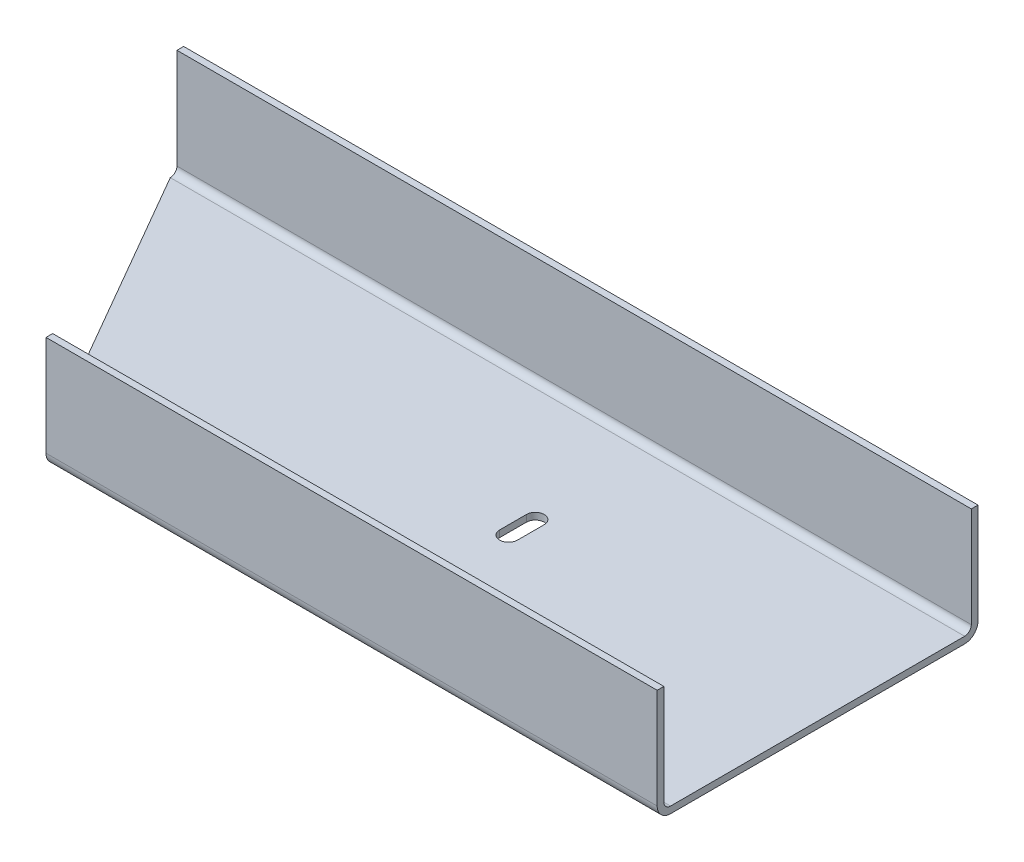
ISO-10303-21;
HEADER;
FILE_DESCRIPTION(('STEP AP214'),'2;1');
FILE_NAME('part.step','',(''),(''),'','','');
FILE_SCHEMA(('AUTOMOTIVE_DESIGN { 1 0 10303 214 1 1 1 1 }'));
ENDSEC;
DATA;
#1=APPLICATION_CONTEXT('core data for automotive mechanical design processes');
#2=APPLICATION_PROTOCOL_DEFINITION('international standard','automotive_design',2000,#1);
#3=PRODUCT_CONTEXT('',#1,'mechanical');
#4=PRODUCT('Part','Part','',(#3));
#5=PRODUCT_RELATED_PRODUCT_CATEGORY('part','',(#4));
#6=PRODUCT_DEFINITION_FORMATION('','',#4);
#7=PRODUCT_DEFINITION_CONTEXT('part definition',#1,'design');
#8=PRODUCT_DEFINITION('design','',#6,#7);
#9=PRODUCT_DEFINITION_SHAPE('','',#8);
#10=(LENGTH_UNIT() NAMED_UNIT(*) SI_UNIT(.MILLI.,.METRE.));
#11=(NAMED_UNIT(*) PLANE_ANGLE_UNIT() SI_UNIT($,.RADIAN.));
#12=(NAMED_UNIT(*) SI_UNIT($,.STERADIAN.) SOLID_ANGLE_UNIT());
#13=UNCERTAINTY_MEASURE_WITH_UNIT(LENGTH_MEASURE(1.E-05),#10,'distance_accuracy_value','');
#14=(GEOMETRIC_REPRESENTATION_CONTEXT(3) GLOBAL_UNCERTAINTY_ASSIGNED_CONTEXT((#13)) GLOBAL_UNIT_ASSIGNED_CONTEXT((#10,
#11,#12)) REPRESENTATION_CONTEXT('',''));
#15=CARTESIAN_POINT('',(0.,0.,0.));
#16=DIRECTION('',(0.,0.,1.));
#17=DIRECTION('',(1.,0.,0.));
#18=AXIS2_PLACEMENT_3D('',#15,#16,#17);
#19=CARTESIAN_POINT('',(-646.229009265076,6.35,152.4));
#20=DIRECTION('',(0.,0.,-1.));
#21=DIRECTION('',(-1.,0.,0.));
#22=AXIS2_PLACEMENT_3D('',#19,#20,#21);
#23=PLANE('',#22);
#24=DIRECTION('',(0.,1.,0.));
#25=VECTOR('',#24,1.);
#26=CARTESIAN_POINT('',(-355.901016080212,30.1625,152.4));
#27=LINE('',#26,#25);
#28=CARTESIAN_POINT('',(-355.901016080212,6.35,152.4));
#29=VERTEX_POINT('',#28);
#30=CARTESIAN_POINT('',(-355.901016080212,53.975,152.4));
#31=VERTEX_POINT('',#30);
#32=EDGE_CURVE('E180',#29,#31,#27,.T.);
#33=ORIENTED_EDGE('',*,*,#32,.T.);
#34=DIRECTION('',(1.,0.,0.));
#35=VECTOR('',#34,1.);
#36=CARTESIAN_POINT('',(-501.065012672644,53.975,152.4));
#37=LINE('',#36,#35);
#38=CARTESIAN_POINT('',(-646.229009265076,53.975,152.4));
#39=VERTEX_POINT('',#38);
#40=EDGE_CURVE('E147',#31,#39,#37,.F.);
#41=ORIENTED_EDGE('',*,*,#40,.T.);
#42=DIRECTION('',(0.,1.,0.));
#43=VECTOR('',#42,1.);
#44=CARTESIAN_POINT('',(-646.229009265076,30.1625,152.4));
#45=LINE('',#44,#43);
#46=CARTESIAN_POINT('',(-646.229009265076,6.35,152.4));
#47=VERTEX_POINT('',#46);
#48=EDGE_CURVE('E259',#39,#47,#45,.F.);
#49=ORIENTED_EDGE('',*,*,#48,.T.);
#50=DIRECTION('',(1.,0.,0.));
#51=VECTOR('',#50,1.);
#52=CARTESIAN_POINT('',(-646.229009265076,6.35,152.4));
#53=LINE('',#52,#51);
#54=EDGE_CURVE('E258',#29,#47,#53,.F.);
#55=ORIENTED_EDGE('',*,*,#54,.F.);
#56=EDGE_LOOP('',(#33,#41,#49,#55));
#57=FACE_BOUND('',#56,.T.);
#58=ADVANCED_FACE('F16',(#57),#23,.F.);
#59=CARTESIAN_POINT('',(-355.901016080212,6.35,0.));
#60=DIRECTION('',(0.,0.,1.));
#61=DIRECTION('',(1.,0.,0.));
#62=AXIS2_PLACEMENT_3D('',#59,#60,#61);
#63=PLANE('',#62);
#64=DIRECTION('',(0.,1.,0.));
#65=VECTOR('',#64,1.);
#66=CARTESIAN_POINT('',(-733.234841870792,30.1625,0.));
#67=LINE('',#66,#65);
#68=CARTESIAN_POINT('',(-733.234841870792,6.35,0.));
#69=VERTEX_POINT('',#68);
#70=CARTESIAN_POINT('',(-733.234841870792,53.975,0.));
#71=VERTEX_POINT('',#70);
#72=EDGE_CURVE('E160',#69,#71,#67,.T.);
#73=ORIENTED_EDGE('',*,*,#72,.T.);
#74=DIRECTION('',(1.,0.,0.));
#75=VECTOR('',#74,1.);
#76=CARTESIAN_POINT('',(-544.567928975502,53.975,0.));
#77=LINE('',#76,#75);
#78=CARTESIAN_POINT('',(-355.901016080212,53.975,0.));
#79=VERTEX_POINT('',#78);
#80=EDGE_CURVE('E157',#71,#79,#77,.T.);
#81=ORIENTED_EDGE('',*,*,#80,.T.);
#82=DIRECTION('',(0.,1.,0.));
#83=VECTOR('',#82,1.);
#84=CARTESIAN_POINT('',(-355.901016080212,30.1625,0.));
#85=LINE('',#84,#83);
#86=CARTESIAN_POINT('',(-355.901016080212,6.35,0.));
#87=VERTEX_POINT('',#86);
#88=EDGE_CURVE('E137',#79,#87,#85,.F.);
#89=ORIENTED_EDGE('',*,*,#88,.T.);
#90=DIRECTION('',(-1.,0.,0.));
#91=VECTOR('',#90,1.);
#92=CARTESIAN_POINT('',(-355.901016080212,6.35,0.));
#93=LINE('',#92,#91);
#94=EDGE_CURVE('E162',#69,#87,#93,.F.);
#95=ORIENTED_EDGE('',*,*,#94,.F.);
#96=EDGE_LOOP('',(#73,#81,#89,#95));
#97=FACE_BOUND('',#96,.T.);
#98=ADVANCED_FACE('F161',(#97),#63,.F.);
#99=CARTESIAN_POINT('',(-544.567928975502,53.975,1.5875));
#100=DIRECTION('',(0.,-1.,0.));
#101=DIRECTION('',(0.,0.,-1.));
#102=AXIS2_PLACEMENT_3D('',#99,#100,#101);
#103=PLANE('',#102);
#104=DIRECTION('',(1.,0.,0.));
#105=VECTOR('',#104,1.);
#106=CARTESIAN_POINT('',(-355.901016080212,53.975,3.175));
#107=LINE('',#106,#105);
#108=CARTESIAN_POINT('',(-355.901016080212,53.975,3.175));
#109=VERTEX_POINT('',#108);
#110=CARTESIAN_POINT('',(-733.234841870792,53.975,3.175));
#111=VERTEX_POINT('',#110);
#112=EDGE_CURVE('E246',#109,#111,#107,.F.);
#113=ORIENTED_EDGE('',*,*,#112,.F.);
#114=DIRECTION('',(0.,0.,1.));
#115=VECTOR('',#114,1.);
#116=CARTESIAN_POINT('',(-355.901016080212,53.975,1.5875));
#117=LINE('',#116,#115);
#118=EDGE_CURVE('E168',#109,#79,#117,.F.);
#119=ORIENTED_EDGE('',*,*,#118,.T.);
#120=ORIENTED_EDGE('',*,*,#80,.F.);
#121=DIRECTION('',(0.,0.,-1.));
#122=VECTOR('',#121,1.);
#123=CARTESIAN_POINT('',(-733.234841870792,53.975,1.5875));
#124=LINE('',#123,#122);
#125=EDGE_CURVE('E167',#71,#111,#124,.F.);
#126=ORIENTED_EDGE('',*,*,#125,.T.);
#127=EDGE_LOOP('',(#113,#119,#120,#126));
#128=FACE_BOUND('',#127,.T.);
#129=ADVANCED_FACE('F171',(#128),#103,.F.);
#130=CARTESIAN_POINT('',(-501.065012672644,53.975,150.8125));
#131=DIRECTION('',(0.,-1.,0.));
#132=DIRECTION('',(0.,0.,-1.));
#133=AXIS2_PLACEMENT_3D('',#130,#131,#132);
#134=PLANE('',#133);
#135=DIRECTION('',(-1.,0.,0.));
#136=VECTOR('',#135,1.);
#137=CARTESIAN_POINT('',(-646.229009265076,53.975,149.225));
#138=LINE('',#137,#136);
#139=CARTESIAN_POINT('',(-646.229009265076,53.975,149.225));
#140=VERTEX_POINT('',#139);
#141=CARTESIAN_POINT('',(-355.901016080212,53.975,149.225));
#142=VERTEX_POINT('',#141);
#143=EDGE_CURVE('E237',#140,#142,#138,.F.);
#144=ORIENTED_EDGE('',*,*,#143,.F.);
#145=DIRECTION('',(0.,0.,-1.));
#146=VECTOR('',#145,1.);
#147=CARTESIAN_POINT('',(-646.229009265076,53.975,150.8125));
#148=LINE('',#147,#146);
#149=EDGE_CURVE('E256',#140,#39,#148,.F.);
#150=ORIENTED_EDGE('',*,*,#149,.T.);
#151=ORIENTED_EDGE('',*,*,#40,.F.);
#152=DIRECTION('',(0.,0.,1.));
#153=VECTOR('',#152,1.);
#154=CARTESIAN_POINT('',(-355.901016080212,53.975,150.8125));
#155=LINE('',#154,#153);
#156=EDGE_CURVE('E267',#31,#142,#155,.F.);
#157=ORIENTED_EDGE('',*,*,#156,.T.);
#158=EDGE_LOOP('',(#144,#150,#151,#157));
#159=FACE_BOUND('',#158,.T.);
#160=ADVANCED_FACE('F482',(#159),#134,.F.);
#161=CARTESIAN_POINT('',(-646.229009265076,6.35,146.05));
#162=DIRECTION('',(1.,0.,0.));
#163=DIRECTION('',(0.,0.,-1.));
#164=AXIS2_PLACEMENT_3D('',#161,#162,#163);
#165=CYLINDRICAL_SURFACE('',#164,6.35);
#166=ORIENTED_EDGE('',*,*,#54,.T.);
#167=CARTESIAN_POINT('',(-646.229009265076,6.35,146.05));
#168=DIRECTION('',(1.,0.,0.));
#169=DIRECTION('',(0.,0.,-1.));
#170=AXIS2_PLACEMENT_3D('',#167,#168,#169);
#171=CIRCLE('',#170,6.35);
#172=CARTESIAN_POINT('',(-646.229009265076,0.,146.050000000013));
#173=VERTEX_POINT('',#172);
#174=EDGE_CURVE('E238',#47,#173,#171,.T.);
#175=ORIENTED_EDGE('',*,*,#174,.T.);
#176=DIRECTION('',(1.,0.,0.));
#177=VECTOR('',#176,1.);
#178=CARTESIAN_POINT('',(0.,0.,146.05));
#179=LINE('',#178,#177);
#180=CARTESIAN_POINT('',(-355.901016080212,0.,146.05));
#181=VERTEX_POINT('',#180);
#182=EDGE_CURVE('E299',#173,#181,#179,.T.);
#183=ORIENTED_EDGE('',*,*,#182,.T.);
#184=CARTESIAN_POINT('',(-355.901016080212,6.35,146.05));
#185=DIRECTION('',(1.,0.,0.));
#186=DIRECTION('',(0.,0.,-1.));
#187=AXIS2_PLACEMENT_3D('',#184,#185,#186);
#188=CIRCLE('',#187,6.35);
#189=EDGE_CURVE('E234',#181,#29,#188,.F.);
#190=ORIENTED_EDGE('',*,*,#189,.T.);
#191=EDGE_LOOP('',(#166,#175,#183,#190));
#192=FACE_BOUND('',#191,.T.);
#193=ADVANCED_FACE('F306',(#192),#165,.T.);
#194=CARTESIAN_POINT('',(-355.901016080212,6.35,6.35));
#195=DIRECTION('',(-1.,0.,0.));
#196=DIRECTION('',(0.,0.,1.));
#197=AXIS2_PLACEMENT_3D('',#194,#195,#196);
#198=CYLINDRICAL_SURFACE('',#197,6.35);
#199=ORIENTED_EDGE('',*,*,#94,.T.);
#200=CARTESIAN_POINT('',(-355.901016080212,6.35,6.35));
#201=DIRECTION('',(-1.,0.,0.));
#202=DIRECTION('',(0.,0.,1.));
#203=AXIS2_PLACEMENT_3D('',#200,#201,#202);
#204=CIRCLE('',#203,6.35);
#205=CARTESIAN_POINT('',(-355.901016080212,0.,6.35));
#206=VERTEX_POINT('',#205);
#207=EDGE_CURVE('E19',#87,#206,#204,.T.);
#208=ORIENTED_EDGE('',*,*,#207,.T.);
#209=DIRECTION('',(1.,0.,0.));
#210=VECTOR('',#209,1.);
#211=CARTESIAN_POINT('',(0.,0.,6.35));
#212=LINE('',#211,#210);
#213=CARTESIAN_POINT('',(-733.234841870828,0.,6.35000000001845));
#214=VERTEX_POINT('',#213);
#215=EDGE_CURVE('E255',#206,#214,#212,.F.);
#216=ORIENTED_EDGE('',*,*,#215,.T.);
#217=CARTESIAN_POINT('',(-733.234841870792,6.35,6.35));
#218=DIRECTION('',(-1.,0.,0.));
#219=DIRECTION('',(0.,0.,1.));
#220=AXIS2_PLACEMENT_3D('',#217,#218,#219);
#221=CIRCLE('',#220,6.35);
#222=EDGE_CURVE('E239',#214,#69,#221,.F.);
#223=ORIENTED_EDGE('',*,*,#222,.T.);
#224=EDGE_LOOP('',(#199,#208,#216,#223));
#225=FACE_BOUND('',#224,.T.);
#226=ADVANCED_FACE('F288',(#225),#198,.T.);
#227=CARTESIAN_POINT('',(-355.901016080212,6.35,3.175));
#228=DIRECTION('',(0.,0.,1.));
#229=DIRECTION('',(1.,0.,0.));
#230=AXIS2_PLACEMENT_3D('',#227,#228,#229);
#231=PLANE('',#230);
#232=DIRECTION('',(-1.,0.,0.));
#233=VECTOR('',#232,1.);
#234=CARTESIAN_POINT('',(-355.901016080212,6.35,3.175));
#235=LINE('',#234,#233);
#236=CARTESIAN_POINT('',(-733.234841870792,6.35,3.175));
#237=VERTEX_POINT('',#236);
#238=CARTESIAN_POINT('',(-355.901016080212,6.35,3.175));
#239=VERTEX_POINT('',#238);
#240=EDGE_CURVE('E230',#237,#239,#235,.F.);
#241=ORIENTED_EDGE('',*,*,#240,.T.);
#242=DIRECTION('',(0.,1.,0.));
#243=VECTOR('',#242,1.);
#244=CARTESIAN_POINT('',(-355.901016080212,6.35,3.175));
#245=LINE('',#244,#243);
#246=EDGE_CURVE('E240',#239,#109,#245,.T.);
#247=ORIENTED_EDGE('',*,*,#246,.T.);
#248=ORIENTED_EDGE('',*,*,#112,.T.);
#249=DIRECTION('',(0.,1.,0.));
#250=VECTOR('',#249,1.);
#251=CARTESIAN_POINT('',(-733.234841870792,6.35,3.175));
#252=LINE('',#251,#250);
#253=EDGE_CURVE('E177',#111,#237,#252,.F.);
#254=ORIENTED_EDGE('',*,*,#253,.T.);
#255=EDGE_LOOP('',(#241,#247,#248,#254));
#256=FACE_BOUND('',#255,.T.);
#257=ADVANCED_FACE('F477',(#256),#231,.T.);
#258=CARTESIAN_POINT('',(-733.234841870792,2.9824039545985,2.9824039545985));
#259=DIRECTION('',(1.,0.,0.));
#260=DIRECTION('',(0.,0.,-1.));
#261=AXIS2_PLACEMENT_3D('',#258,#259,#260);
#262=PLANE('',#261);
#263=CARTESIAN_POINT('',(-733.234841870792,6.35,6.35));
#264=DIRECTION('',(-1.,0.,0.));
#265=DIRECTION('',(0.,0.,1.));
#266=AXIS2_PLACEMENT_3D('',#263,#264,#265);
#267=CIRCLE('',#266,3.175);
#268=CARTESIAN_POINT('',(-733.234841870817,3.175,6.35000000002765));
#269=VERTEX_POINT('',#268);
#270=EDGE_CURVE('E228',#269,#237,#267,.F.);
#271=ORIENTED_EDGE('',*,*,#270,.T.);
#272=ORIENTED_EDGE('',*,*,#253,.F.);
#273=ORIENTED_EDGE('',*,*,#125,.F.);
#274=ORIENTED_EDGE('',*,*,#72,.F.);
#275=ORIENTED_EDGE('',*,*,#222,.F.);
#276=DIRECTION('',(0.,1.,0.));
#277=VECTOR('',#276,1.);
#278=CARTESIAN_POINT('',(-733.234841870843,1.5875,6.35000000003687));
#279=LINE('',#278,#277);
#280=EDGE_CURVE('E321',#214,#269,#279,.T.);
#281=ORIENTED_EDGE('',*,*,#280,.T.);
#282=EDGE_LOOP('',(#271,#272,#273,#274,#275,#281));
#283=FACE_BOUND('',#282,.T.);
#284=ADVANCED_FACE('F175',(#283),#262,.F.);
#285=CARTESIAN_POINT('',(-646.229009265076,2.9824039545985,149.417596045414));
#286=DIRECTION('',(1.,0.,0.));
#287=DIRECTION('',(0.,0.,-1.));
#288=AXIS2_PLACEMENT_3D('',#285,#286,#287);
#289=PLANE('',#288);
#290=CARTESIAN_POINT('',(-646.229009265076,6.35,146.05));
#291=DIRECTION('',(1.,0.,0.));
#292=DIRECTION('',(0.,0.,-1.));
#293=AXIS2_PLACEMENT_3D('',#290,#291,#292);
#294=CIRCLE('',#293,3.175);
#295=CARTESIAN_POINT('',(-646.229009265076,6.35,149.225));
#296=VERTEX_POINT('',#295);
#297=CARTESIAN_POINT('',(-646.229009265076,3.175,146.050000000013));
#298=VERTEX_POINT('',#297);
#299=EDGE_CURVE('E225',#296,#298,#294,.T.);
#300=ORIENTED_EDGE('',*,*,#299,.T.);
#301=DIRECTION('',(0.,1.,0.));
#302=VECTOR('',#301,1.);
#303=CARTESIAN_POINT('',(-646.229009265076,1.5875,146.050000000025));
#304=LINE('',#303,#302);
#305=EDGE_CURVE('E320',#298,#173,#304,.F.);
#306=ORIENTED_EDGE('',*,*,#305,.T.);
#307=ORIENTED_EDGE('',*,*,#174,.F.);
#308=ORIENTED_EDGE('',*,*,#48,.F.);
#309=ORIENTED_EDGE('',*,*,#149,.F.);
#310=DIRECTION('',(0.,1.,0.));
#311=VECTOR('',#310,1.);
#312=CARTESIAN_POINT('',(-646.229009265076,6.35,149.225));
#313=LINE('',#312,#311);
#314=EDGE_CURVE('E310',#296,#140,#313,.T.);
#315=ORIENTED_EDGE('',*,*,#314,.F.);
#316=EDGE_LOOP('',(#300,#306,#307,#308,#309,#315));
#317=FACE_BOUND('',#316,.T.);
#318=ADVANCED_FACE('F354',(#317),#289,.F.);
#319=CARTESIAN_POINT('',(-646.229009265076,6.35,149.225));
#320=DIRECTION('',(0.,0.,-1.));
#321=DIRECTION('',(-1.,0.,0.));
#322=AXIS2_PLACEMENT_3D('',#319,#320,#321);
#323=PLANE('',#322);
#324=DIRECTION('',(1.,0.,0.));
#325=VECTOR('',#324,1.);
#326=CARTESIAN_POINT('',(-646.229009265076,6.35,149.225));
#327=LINE('',#326,#325);
#328=CARTESIAN_POINT('',(-355.901016080212,6.35,149.225));
#329=VERTEX_POINT('',#328);
#330=EDGE_CURVE('E224',#329,#296,#327,.F.);
#331=ORIENTED_EDGE('',*,*,#330,.T.);
#332=ORIENTED_EDGE('',*,*,#314,.T.);
#333=ORIENTED_EDGE('',*,*,#143,.T.);
#334=DIRECTION('',(0.,1.,0.));
#335=VECTOR('',#334,1.);
#336=CARTESIAN_POINT('',(-355.901016080212,6.35,149.225));
#337=LINE('',#336,#335);
#338=EDGE_CURVE('E264',#142,#329,#337,.F.);
#339=ORIENTED_EDGE('',*,*,#338,.T.);
#340=EDGE_LOOP('',(#331,#332,#333,#339));
#341=FACE_BOUND('',#340,.T.);
#342=ADVANCED_FACE('F431',(#341),#323,.T.);
#343=CARTESIAN_POINT('',(0.,0.,0.));
#344=DIRECTION('',(0.,1.,0.));
#345=DIRECTION('',(0.,0.,1.));
#346=AXIS2_PLACEMENT_3D('',#343,#344,#345);
#347=PLANE('',#346);
#348=CARTESIAN_POINT('',(-505.8664,0.,120.65));
#349=DIRECTION('',(0.,1.,0.));
#350=DIRECTION('',(0.,0.,1.));
#351=AXIS2_PLACEMENT_3D('',#348,#349,#350);
#352=CIRCLE('',#351,4.2164);
#353=CARTESIAN_POINT('',(-510.0828,0.,120.65));
#354=VERTEX_POINT('',#353);
#355=CARTESIAN_POINT('',(-501.65,0.,120.65));
#356=VERTEX_POINT('',#355);
#357=EDGE_CURVE('E218',#354,#356,#352,.T.);
#358=ORIENTED_EDGE('',*,*,#357,.T.);
#359=DIRECTION('',(0.,0.,-1.));
#360=VECTOR('',#359,1.);
#361=CARTESIAN_POINT('',(-501.65,0.,114.3));
#362=LINE('',#361,#360);
#363=CARTESIAN_POINT('',(-501.65,0.,107.95));
#364=VERTEX_POINT('',#363);
#365=EDGE_CURVE('E221',#356,#364,#362,.T.);
#366=ORIENTED_EDGE('',*,*,#365,.T.);
#367=CARTESIAN_POINT('',(-505.8664,0.,107.95));
#368=DIRECTION('',(0.,1.,0.));
#369=DIRECTION('',(0.,0.,1.));
#370=AXIS2_PLACEMENT_3D('',#367,#368,#369);
#371=CIRCLE('',#370,4.2164);
#372=CARTESIAN_POINT('',(-510.0828,0.,107.95));
#373=VERTEX_POINT('',#372);
#374=EDGE_CURVE('E214',#364,#373,#371,.T.);
#375=ORIENTED_EDGE('',*,*,#374,.T.);
#376=DIRECTION('',(0.,0.,1.));
#377=VECTOR('',#376,1.);
#378=CARTESIAN_POINT('',(-510.0828,0.,114.3));
#379=LINE('',#378,#377);
#380=EDGE_CURVE('E341',#373,#354,#379,.T.);
#381=ORIENTED_EDGE('',*,*,#380,.T.);
#382=EDGE_LOOP('',(#358,#366,#375,#381));
#383=FACE_BOUND('',#382,.T.);
#384=CARTESIAN_POINT('',(-505.8664,0.,73.025));
#385=DIRECTION('',(0.,1.,0.));
#386=DIRECTION('',(0.,0.,1.));
#387=AXIS2_PLACEMENT_3D('',#384,#385,#386);
#388=CIRCLE('',#387,4.2164);
#389=CARTESIAN_POINT('',(-510.0828,0.,73.025));
#390=VERTEX_POINT('',#389);
#391=CARTESIAN_POINT('',(-501.65,0.,73.025));
#392=VERTEX_POINT('',#391);
#393=EDGE_CURVE('E210',#390,#392,#388,.T.);
#394=ORIENTED_EDGE('',*,*,#393,.T.);
#395=DIRECTION('',(0.,0.,-1.));
#396=VECTOR('',#395,1.);
#397=CARTESIAN_POINT('',(-501.65,0.,66.675));
#398=LINE('',#397,#396);
#399=CARTESIAN_POINT('',(-501.65,0.,60.325));
#400=VERTEX_POINT('',#399);
#401=EDGE_CURVE('E213',#392,#400,#398,.T.);
#402=ORIENTED_EDGE('',*,*,#401,.T.);
#403=CARTESIAN_POINT('',(-505.8664,0.,60.325));
#404=DIRECTION('',(0.,1.,0.));
#405=DIRECTION('',(0.,0.,1.));
#406=AXIS2_PLACEMENT_3D('',#403,#404,#405);
#407=CIRCLE('',#406,4.2164);
#408=CARTESIAN_POINT('',(-510.0828,0.,60.325));
#409=VERTEX_POINT('',#408);
#410=EDGE_CURVE('E207',#400,#409,#407,.T.);
#411=ORIENTED_EDGE('',*,*,#410,.T.);
#412=DIRECTION('',(0.,0.,1.));
#413=VECTOR('',#412,1.);
#414=CARTESIAN_POINT('',(-510.0828,0.,66.675));
#415=LINE('',#414,#413);
#416=EDGE_CURVE('E379',#409,#390,#415,.T.);
#417=ORIENTED_EDGE('',*,*,#416,.T.);
#418=EDGE_LOOP('',(#394,#402,#411,#417));
#419=FACE_BOUND('',#418,.T.);
#420=DIRECTION('',(-0.500000000000017,0.,-0.866025403784429));
#421=VECTOR('',#420,1.);
#422=CARTESIAN_POINT('',(-694.740012672644,0.,73.025));
#423=LINE('',#422,#421);
#424=CARTESIAN_POINT('',(-652.579009265072,0.,146.050000000023));
#425=VERTEX_POINT('',#424);
#426=EDGE_CURVE('E297',#425,#214,#423,.T.);
#427=ORIENTED_EDGE('',*,*,#426,.T.);
#428=ORIENTED_EDGE('',*,*,#215,.F.);
#429=DIRECTION('',(0.,0.,1.));
#430=VECTOR('',#429,1.);
#431=CARTESIAN_POINT('',(-355.901016080212,0.,76.2));
#432=LINE('',#431,#430);
#433=EDGE_CURVE('E233',#206,#181,#432,.T.);
#434=ORIENTED_EDGE('',*,*,#433,.T.);
#435=ORIENTED_EDGE('',*,*,#182,.F.);
#436=DIRECTION('',(-1.,0.,0.));
#437=VECTOR('',#436,1.);
#438=CARTESIAN_POINT('',(-649.404009265076,0.,146.050000000025));
#439=LINE('',#438,#437);
#440=EDGE_CURVE('E318',#173,#425,#439,.T.);
#441=ORIENTED_EDGE('',*,*,#440,.T.);
#442=EDGE_LOOP('',(#427,#428,#434,#435,#441));
#443=FACE_BOUND('',#442,.T.);
#444=ADVANCED_FACE('F293',(#383,#419,#443),#347,.F.);
#445=CARTESIAN_POINT('',(-355.901016080212,1.5875,76.2));
#446=DIRECTION('',(-1.,0.,0.));
#447=DIRECTION('',(0.,0.,1.));
#448=AXIS2_PLACEMENT_3D('',#445,#446,#447);
#449=PLANE('',#448);
#450=ORIENTED_EDGE('',*,*,#433,.F.);
#451=ORIENTED_EDGE('',*,*,#207,.F.);
#452=ORIENTED_EDGE('',*,*,#88,.F.);
#453=ORIENTED_EDGE('',*,*,#118,.F.);
#454=ORIENTED_EDGE('',*,*,#246,.F.);
#455=CARTESIAN_POINT('',(-355.901016080212,6.35,6.35));
#456=DIRECTION('',(-1.,0.,0.));
#457=DIRECTION('',(0.,0.,1.));
#458=AXIS2_PLACEMENT_3D('',#455,#456,#457);
#459=CIRCLE('',#458,3.175);
#460=CARTESIAN_POINT('',(-355.901016080212,3.175,6.35));
#461=VERTEX_POINT('',#460);
#462=EDGE_CURVE('E231',#239,#461,#459,.T.);
#463=ORIENTED_EDGE('',*,*,#462,.T.);
#464=DIRECTION('',(0.,0.,1.));
#465=VECTOR('',#464,1.);
#466=CARTESIAN_POINT('',(-355.901016080212,3.175,0.));
#467=LINE('',#466,#465);
#468=CARTESIAN_POINT('',(-355.901016080212,3.175,146.05));
#469=VERTEX_POINT('',#468);
#470=EDGE_CURVE('E329',#469,#461,#467,.F.);
#471=ORIENTED_EDGE('',*,*,#470,.F.);
#472=CARTESIAN_POINT('',(-355.901016080212,6.35,146.05));
#473=DIRECTION('',(1.,0.,0.));
#474=DIRECTION('',(0.,0.,-1.));
#475=AXIS2_PLACEMENT_3D('',#472,#473,#474);
#476=CIRCLE('',#475,3.175);
#477=EDGE_CURVE('E222',#469,#329,#476,.F.);
#478=ORIENTED_EDGE('',*,*,#477,.T.);
#479=ORIENTED_EDGE('',*,*,#338,.F.);
#480=ORIENTED_EDGE('',*,*,#156,.F.);
#481=ORIENTED_EDGE('',*,*,#32,.F.);
#482=ORIENTED_EDGE('',*,*,#189,.F.);
#483=EDGE_LOOP('',(#450,#451,#452,#453,#454,#463,#471,#478,#479,#480,#481,#482));
#484=FACE_BOUND('',#483,.T.);
#485=ADVANCED_FACE('F302',(#484),#449,.F.);
#486=CARTESIAN_POINT('',(-355.901016080212,6.35,6.35));
#487=DIRECTION('',(-1.,0.,0.));
#488=DIRECTION('',(0.,0.,1.));
#489=AXIS2_PLACEMENT_3D('',#486,#487,#488);
#490=CYLINDRICAL_SURFACE('',#489,3.175);
#491=ORIENTED_EDGE('',*,*,#270,.F.);
#492=DIRECTION('',(1.,0.,0.));
#493=VECTOR('',#492,1.);
#494=CARTESIAN_POINT('',(0.,3.175,6.35));
#495=LINE('',#494,#493);
#496=EDGE_CURVE('E327',#461,#269,#495,.F.);
#497=ORIENTED_EDGE('',*,*,#496,.F.);
#498=ORIENTED_EDGE('',*,*,#462,.F.);
#499=ORIENTED_EDGE('',*,*,#240,.F.);
#500=EDGE_LOOP('',(#491,#497,#498,#499));
#501=FACE_BOUND('',#500,.T.);
#502=ADVANCED_FACE('F438',(#501),#490,.F.);
#503=CARTESIAN_POINT('',(-694.740012672644,1.5875,73.025));
#504=DIRECTION('',(0.866025403784429,0.,-0.500000000000017));
#505=DIRECTION('',(-0.500000000000017,0.,-0.866025403784429));
#506=AXIS2_PLACEMENT_3D('',#503,#504,#505);
#507=PLANE('',#506);
#508=DIRECTION('',(0.,1.,0.));
#509=VECTOR('',#508,1.);
#510=CARTESIAN_POINT('',(-652.579009265076,1.5875,146.050000000025));
#511=LINE('',#510,#509);
#512=CARTESIAN_POINT('',(-652.579009265068,3.175,146.050000000021));
#513=VERTEX_POINT('',#512);
#514=EDGE_CURVE('E227',#425,#513,#511,.T.);
#515=ORIENTED_EDGE('',*,*,#514,.T.);
#516=DIRECTION('',(0.499999999999605,0.,0.866025403784667));
#517=VECTOR('',#516,1.);
#518=CARTESIAN_POINT('',(-733.234841870792,3.175,6.35000000000762));
#519=LINE('',#518,#517);
#520=EDGE_CURVE('E324',#269,#513,#519,.T.);
#521=ORIENTED_EDGE('',*,*,#520,.F.);
#522=ORIENTED_EDGE('',*,*,#280,.F.);
#523=ORIENTED_EDGE('',*,*,#426,.F.);
#524=EDGE_LOOP('',(#515,#521,#522,#523));
#525=FACE_BOUND('',#524,.T.);
#526=ADVANCED_FACE('F372',(#525),#507,.F.);
#527=CARTESIAN_POINT('',(-649.404009265076,1.5875,146.050000000025));
#528=DIRECTION('',(0.,0.,-1.));
#529=DIRECTION('',(-1.,0.,0.));
#530=AXIS2_PLACEMENT_3D('',#527,#528,#529);
#531=PLANE('',#530);
#532=ORIENTED_EDGE('',*,*,#514,.F.);
#533=ORIENTED_EDGE('',*,*,#440,.F.);
#534=ORIENTED_EDGE('',*,*,#305,.F.);
#535=DIRECTION('',(1.,0.,0.));
#536=VECTOR('',#535,1.);
#537=CARTESIAN_POINT('',(0.,3.175,146.050000000025));
#538=LINE('',#537,#536);
#539=EDGE_CURVE('E316',#513,#298,#538,.T.);
#540=ORIENTED_EDGE('',*,*,#539,.F.);
#541=EDGE_LOOP('',(#532,#533,#534,#540));
#542=FACE_BOUND('',#541,.T.);
#543=ADVANCED_FACE('F361',(#542),#531,.F.);
#544=CARTESIAN_POINT('',(-646.229009265076,6.35,146.05));
#545=DIRECTION('',(1.,0.,0.));
#546=DIRECTION('',(0.,0.,-1.));
#547=AXIS2_PLACEMENT_3D('',#544,#545,#546);
#548=CYLINDRICAL_SURFACE('',#547,3.175);
#549=ORIENTED_EDGE('',*,*,#477,.F.);
#550=DIRECTION('',(1.,0.,0.));
#551=VECTOR('',#550,1.);
#552=CARTESIAN_POINT('',(0.,3.175,146.05));
#553=LINE('',#552,#551);
#554=EDGE_CURVE('E343',#298,#469,#553,.T.);
#555=ORIENTED_EDGE('',*,*,#554,.F.);
#556=ORIENTED_EDGE('',*,*,#299,.F.);
#557=ORIENTED_EDGE('',*,*,#330,.F.);
#558=EDGE_LOOP('',(#549,#555,#556,#557));
#559=FACE_BOUND('',#558,.T.);
#560=ADVANCED_FACE('F365',(#559),#548,.F.);
#561=CARTESIAN_POINT('',(-501.65,1.5875,114.3));
#562=DIRECTION('',(1.,0.,0.));
#563=DIRECTION('',(0.,0.,-1.));
#564=AXIS2_PLACEMENT_3D('',#561,#562,#563);
#565=PLANE('',#564);
#566=DIRECTION('',(0.,0.,1.));
#567=VECTOR('',#566,1.);
#568=CARTESIAN_POINT('',(-501.65,3.175,0.));
#569=LINE('',#568,#567);
#570=CARTESIAN_POINT('',(-501.65,3.175,107.95));
#571=VERTEX_POINT('',#570);
#572=CARTESIAN_POINT('',(-501.65,3.175,120.65));
#573=VERTEX_POINT('',#572);
#574=EDGE_CURVE('E206',#571,#573,#569,.T.);
#575=ORIENTED_EDGE('',*,*,#574,.F.);
#576=DIRECTION('',(0.,1.,0.));
#577=VECTOR('',#576,1.);
#578=CARTESIAN_POINT('',(-501.65,1.5875,107.95));
#579=LINE('',#578,#577);
#580=EDGE_CURVE('E378',#571,#364,#579,.F.);
#581=ORIENTED_EDGE('',*,*,#580,.T.);
#582=ORIENTED_EDGE('',*,*,#365,.F.);
#583=DIRECTION('',(0.,1.,0.));
#584=VECTOR('',#583,1.);
#585=CARTESIAN_POINT('',(-501.65,1.5875,120.65));
#586=LINE('',#585,#584);
#587=EDGE_CURVE('E220',#356,#573,#586,.T.);
#588=ORIENTED_EDGE('',*,*,#587,.T.);
#589=EDGE_LOOP('',(#575,#581,#582,#588));
#590=FACE_BOUND('',#589,.T.);
#591=ADVANCED_FACE('F390',(#590),#565,.F.);
#592=CARTESIAN_POINT('',(-505.8664,1.5875,120.65));
#593=DIRECTION('',(0.,1.,0.));
#594=DIRECTION('',(0.,0.,1.));
#595=AXIS2_PLACEMENT_3D('',#592,#593,#594);
#596=CYLINDRICAL_SURFACE('',#595,4.2164);
#597=CARTESIAN_POINT('',(-505.8664,3.175,120.65));
#598=DIRECTION('',(0.,1.,0.));
#599=DIRECTION('',(0.,0.,1.));
#600=AXIS2_PLACEMENT_3D('',#597,#598,#599);
#601=CIRCLE('',#600,4.2164);
#602=CARTESIAN_POINT('',(-510.0828,3.175,120.65));
#603=VERTEX_POINT('',#602);
#604=EDGE_CURVE('E203',#573,#603,#601,.F.);
#605=ORIENTED_EDGE('',*,*,#604,.F.);
#606=ORIENTED_EDGE('',*,*,#587,.F.);
#607=ORIENTED_EDGE('',*,*,#357,.F.);
#608=DIRECTION('',(0.,1.,0.));
#609=VECTOR('',#608,1.);
#610=CARTESIAN_POINT('',(-510.0828,1.5875,120.65));
#611=LINE('',#610,#609);
#612=EDGE_CURVE('E217',#354,#603,#611,.T.);
#613=ORIENTED_EDGE('',*,*,#612,.T.);
#614=EDGE_LOOP('',(#605,#606,#607,#613));
#615=FACE_BOUND('',#614,.T.);
#616=ADVANCED_FACE('F406',(#615),#596,.F.);
#617=CARTESIAN_POINT('',(-510.0828,1.5875,114.3));
#618=DIRECTION('',(-1.,0.,0.));
#619=DIRECTION('',(0.,0.,1.));
#620=AXIS2_PLACEMENT_3D('',#617,#618,#619);
#621=PLANE('',#620);
#622=DIRECTION('',(0.,0.,1.));
#623=VECTOR('',#622,1.);
#624=CARTESIAN_POINT('',(-510.0828,3.175,0.));
#625=LINE('',#624,#623);
#626=CARTESIAN_POINT('',(-510.0828,3.175,107.95));
#627=VERTEX_POINT('',#626);
#628=EDGE_CURVE('E202',#603,#627,#625,.F.);
#629=ORIENTED_EDGE('',*,*,#628,.F.);
#630=ORIENTED_EDGE('',*,*,#612,.F.);
#631=ORIENTED_EDGE('',*,*,#380,.F.);
#632=DIRECTION('',(0.,1.,0.));
#633=VECTOR('',#632,1.);
#634=CARTESIAN_POINT('',(-510.0828,1.5875,107.95));
#635=LINE('',#634,#633);
#636=EDGE_CURVE('E216',#373,#627,#635,.T.);
#637=ORIENTED_EDGE('',*,*,#636,.T.);
#638=EDGE_LOOP('',(#629,#630,#631,#637));
#639=FACE_BOUND('',#638,.T.);
#640=ADVANCED_FACE('F457',(#639),#621,.F.);
#641=CARTESIAN_POINT('',(-505.8664,1.5875,107.95));
#642=DIRECTION('',(0.,1.,0.));
#643=DIRECTION('',(0.,0.,1.));
#644=AXIS2_PLACEMENT_3D('',#641,#642,#643);
#645=CYLINDRICAL_SURFACE('',#644,4.2164);
#646=CARTESIAN_POINT('',(-505.8664,3.175,107.95));
#647=DIRECTION('',(0.,1.,0.));
#648=DIRECTION('',(0.,0.,1.));
#649=AXIS2_PLACEMENT_3D('',#646,#647,#648);
#650=CIRCLE('',#649,4.2164);
#651=EDGE_CURVE('E199',#627,#571,#650,.F.);
#652=ORIENTED_EDGE('',*,*,#651,.F.);
#653=ORIENTED_EDGE('',*,*,#636,.F.);
#654=ORIENTED_EDGE('',*,*,#374,.F.);
#655=ORIENTED_EDGE('',*,*,#580,.F.);
#656=EDGE_LOOP('',(#652,#653,#654,#655));
#657=FACE_BOUND('',#656,.T.);
#658=ADVANCED_FACE('F396',(#657),#645,.F.);
#659=CARTESIAN_POINT('',(-501.65,1.5875,66.675));
#660=DIRECTION('',(1.,0.,0.));
#661=DIRECTION('',(0.,0.,-1.));
#662=AXIS2_PLACEMENT_3D('',#659,#660,#661);
#663=PLANE('',#662);
#664=DIRECTION('',(0.,0.,1.));
#665=VECTOR('',#664,1.);
#666=CARTESIAN_POINT('',(-501.65,3.175,0.));
#667=LINE('',#666,#665);
#668=CARTESIAN_POINT('',(-501.65,3.175,60.325));
#669=VERTEX_POINT('',#668);
#670=CARTESIAN_POINT('',(-501.65,3.175,73.025));
#671=VERTEX_POINT('',#670);
#672=EDGE_CURVE('E198',#669,#671,#667,.T.);
#673=ORIENTED_EDGE('',*,*,#672,.F.);
#674=DIRECTION('',(0.,1.,0.));
#675=VECTOR('',#674,1.);
#676=CARTESIAN_POINT('',(-501.65,1.5875,60.325));
#677=LINE('',#676,#675);
#678=EDGE_CURVE('E334',#669,#400,#677,.F.);
#679=ORIENTED_EDGE('',*,*,#678,.T.);
#680=ORIENTED_EDGE('',*,*,#401,.F.);
#681=DIRECTION('',(0.,1.,0.));
#682=VECTOR('',#681,1.);
#683=CARTESIAN_POINT('',(-501.65,1.5875,73.025));
#684=LINE('',#683,#682);
#685=EDGE_CURVE('E212',#392,#671,#684,.T.);
#686=ORIENTED_EDGE('',*,*,#685,.T.);
#687=EDGE_LOOP('',(#673,#679,#680,#686));
#688=FACE_BOUND('',#687,.T.);
#689=ADVANCED_FACE('F425',(#688),#663,.F.);
#690=CARTESIAN_POINT('',(-505.8664,1.5875,73.025));
#691=DIRECTION('',(0.,1.,0.));
#692=DIRECTION('',(0.,0.,1.));
#693=AXIS2_PLACEMENT_3D('',#690,#691,#692);
#694=CYLINDRICAL_SURFACE('',#693,4.2164);
#695=CARTESIAN_POINT('',(-505.8664,3.175,73.025));
#696=DIRECTION('',(0.,1.,0.));
#697=DIRECTION('',(0.,0.,1.));
#698=AXIS2_PLACEMENT_3D('',#695,#696,#697);
#699=CIRCLE('',#698,4.2164);
#700=CARTESIAN_POINT('',(-510.0828,3.175,73.025));
#701=VERTEX_POINT('',#700);
#702=EDGE_CURVE('E195',#671,#701,#699,.F.);
#703=ORIENTED_EDGE('',*,*,#702,.F.);
#704=ORIENTED_EDGE('',*,*,#685,.F.);
#705=ORIENTED_EDGE('',*,*,#393,.F.);
#706=DIRECTION('',(0.,1.,0.));
#707=VECTOR('',#706,1.);
#708=CARTESIAN_POINT('',(-510.0828,1.5875,73.025));
#709=LINE('',#708,#707);
#710=EDGE_CURVE('E209',#390,#701,#709,.T.);
#711=ORIENTED_EDGE('',*,*,#710,.T.);
#712=EDGE_LOOP('',(#703,#704,#705,#711));
#713=FACE_BOUND('',#712,.T.);
#714=ADVANCED_FACE('F416',(#713),#694,.F.);
#715=CARTESIAN_POINT('',(-510.0828,1.5875,66.675));
#716=DIRECTION('',(-1.,0.,0.));
#717=DIRECTION('',(0.,0.,1.));
#718=AXIS2_PLACEMENT_3D('',#715,#716,#717);
#719=PLANE('',#718);
#720=DIRECTION('',(0.,0.,1.));
#721=VECTOR('',#720,1.);
#722=CARTESIAN_POINT('',(-510.0828,3.175,0.));
#723=LINE('',#722,#721);
#724=CARTESIAN_POINT('',(-510.0828,3.175,60.325));
#725=VERTEX_POINT('',#724);
#726=EDGE_CURVE('E25',#701,#725,#723,.F.);
#727=ORIENTED_EDGE('',*,*,#726,.F.);
#728=ORIENTED_EDGE('',*,*,#710,.F.);
#729=ORIENTED_EDGE('',*,*,#416,.F.);
#730=DIRECTION('',(0.,1.,0.));
#731=VECTOR('',#730,1.);
#732=CARTESIAN_POINT('',(-510.0828,1.5875,60.325));
#733=LINE('',#732,#731);
#734=EDGE_CURVE('E34',#409,#725,#733,.T.);
#735=ORIENTED_EDGE('',*,*,#734,.T.);
#736=EDGE_LOOP('',(#727,#728,#729,#735));
#737=FACE_BOUND('',#736,.T.);
#738=ADVANCED_FACE('F420',(#737),#719,.F.);
#739=CARTESIAN_POINT('',(-505.8664,1.5875,60.325));
#740=DIRECTION('',(0.,1.,0.));
#741=DIRECTION('',(0.,0.,1.));
#742=AXIS2_PLACEMENT_3D('',#739,#740,#741);
#743=CYLINDRICAL_SURFACE('',#742,4.2164);
#744=CARTESIAN_POINT('',(-505.8664,3.175,60.325));
#745=DIRECTION('',(0.,1.,0.));
#746=DIRECTION('',(0.,0.,1.));
#747=AXIS2_PLACEMENT_3D('',#744,#745,#746);
#748=CIRCLE('',#747,4.2164);
#749=EDGE_CURVE('E11',#725,#669,#748,.F.);
#750=ORIENTED_EDGE('',*,*,#749,.F.);
#751=ORIENTED_EDGE('',*,*,#734,.F.);
#752=ORIENTED_EDGE('',*,*,#410,.F.);
#753=ORIENTED_EDGE('',*,*,#678,.F.);
#754=EDGE_LOOP('',(#750,#751,#752,#753));
#755=FACE_BOUND('',#754,.T.);
#756=ADVANCED_FACE('F429',(#755),#743,.F.);
#757=CARTESIAN_POINT('',(0.,3.175,0.));
#758=DIRECTION('',(0.,1.,0.));
#759=DIRECTION('',(0.,0.,1.));
#760=AXIS2_PLACEMENT_3D('',#757,#758,#759);
#761=PLANE('',#760);
#762=ORIENTED_EDGE('',*,*,#726,.T.);
#763=ORIENTED_EDGE('',*,*,#749,.T.);
#764=ORIENTED_EDGE('',*,*,#672,.T.);
#765=ORIENTED_EDGE('',*,*,#702,.T.);
#766=EDGE_LOOP('',(#762,#763,#764,#765));
#767=FACE_BOUND('',#766,.T.);
#768=ORIENTED_EDGE('',*,*,#628,.T.);
#769=ORIENTED_EDGE('',*,*,#651,.T.);
#770=ORIENTED_EDGE('',*,*,#574,.T.);
#771=ORIENTED_EDGE('',*,*,#604,.T.);
#772=EDGE_LOOP('',(#768,#769,#770,#771));
#773=FACE_BOUND('',#772,.T.);
#774=ORIENTED_EDGE('',*,*,#539,.T.);
#775=ORIENTED_EDGE('',*,*,#554,.T.);
#776=ORIENTED_EDGE('',*,*,#470,.T.);
#777=ORIENTED_EDGE('',*,*,#496,.T.);
#778=ORIENTED_EDGE('',*,*,#520,.T.);
#779=EDGE_LOOP('',(#774,#775,#776,#777,#778));
#780=FACE_BOUND('',#779,.T.);
#781=ADVANCED_FACE('F367',(#767,#773,#780),#761,.T.);
#782=CLOSED_SHELL('',(#58,#98,#129,#160,#193,#226,#257,#284,#318,#342,#444,#485,#502,#526,#543,
#560,#591,#616,#640,#658,#689,#714,#738,#756,#781));
#783=MANIFOLD_SOLID_BREP('B1',#782);
#784=ADVANCED_BREP_SHAPE_REPRESENTATION('',(#18,#783),#14);
#785=SHAPE_DEFINITION_REPRESENTATION(#9,#784);
ENDSEC;
END-ISO-10303-21;
